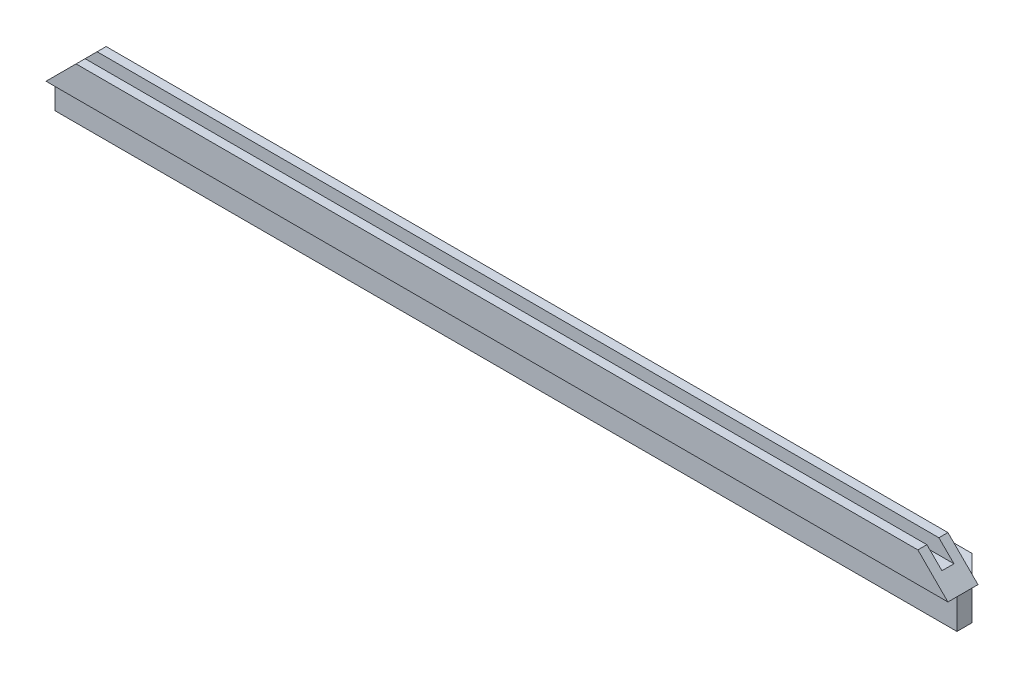
ISO-10303-21;
HEADER;
FILE_DESCRIPTION(('STEP AP214'),'2;1');
FILE_NAME('part.step','',(''),(''),'','','');
FILE_SCHEMA(('AUTOMOTIVE_DESIGN { 1 0 10303 214 1 1 1 1 }'));
ENDSEC;
DATA;
#1=APPLICATION_CONTEXT('core data for automotive mechanical design processes');
#2=APPLICATION_PROTOCOL_DEFINITION('international standard','automotive_design',2000,#1);
#3=PRODUCT_CONTEXT('',#1,'mechanical');
#4=PRODUCT('Part','Part','',(#3));
#5=PRODUCT_RELATED_PRODUCT_CATEGORY('part','',(#4));
#6=PRODUCT_DEFINITION_FORMATION('','',#4);
#7=PRODUCT_DEFINITION_CONTEXT('part definition',#1,'design');
#8=PRODUCT_DEFINITION('design','',#6,#7);
#9=PRODUCT_DEFINITION_SHAPE('','',#8);
#10=(LENGTH_UNIT() NAMED_UNIT(*) SI_UNIT(.MILLI.,.METRE.));
#11=(NAMED_UNIT(*) PLANE_ANGLE_UNIT() SI_UNIT($,.RADIAN.));
#12=(NAMED_UNIT(*) SI_UNIT($,.STERADIAN.) SOLID_ANGLE_UNIT());
#13=UNCERTAINTY_MEASURE_WITH_UNIT(LENGTH_MEASURE(1.E-05),#10,'distance_accuracy_value','');
#14=(GEOMETRIC_REPRESENTATION_CONTEXT(3) GLOBAL_UNCERTAINTY_ASSIGNED_CONTEXT((#13)) GLOBAL_UNIT_ASSIGNED_CONTEXT((#10,
#11,#12)) REPRESENTATION_CONTEXT('',''));
#15=CARTESIAN_POINT('',(0.,0.,0.));
#16=DIRECTION('',(0.,0.,1.));
#17=DIRECTION('',(1.,0.,0.));
#18=AXIS2_PLACEMENT_3D('',#15,#16,#17);
#19=CARTESIAN_POINT('',(0.,0.,41.9259450509896));
#20=DIRECTION('',(0.,0.,1.));
#21=DIRECTION('',(1.,0.,0.));
#22=AXIS2_PLACEMENT_3D('',#19,#20,#21);
#23=PLANE('',#22);
#24=DIRECTION('',(0.,1.,0.));
#25=VECTOR('',#24,1.);
#26=CARTESIAN_POINT('',(169.358553026499,7.,41.9259450509896));
#27=LINE('',#26,#25);
#28=CARTESIAN_POINT('',(169.358553026499,-3.,41.9259450509896));
#29=VERTEX_POINT('',#28);
#30=CARTESIAN_POINT('',(169.358553026499,7.,41.9259450509896));
#31=VERTEX_POINT('',#30);
#32=EDGE_CURVE('E259',#29,#31,#27,.T.);
#33=ORIENTED_EDGE('',*,*,#32,.T.);
#34=DIRECTION('',(-1.,0.,0.));
#35=VECTOR('',#34,1.);
#36=CARTESIAN_POINT('',(169.358553026499,7.,41.9259450509896));
#37=LINE('',#36,#35);
#38=CARTESIAN_POINT('',(-130.641446973501,7.,41.9259450509896));
#39=VERTEX_POINT('',#38);
#40=EDGE_CURVE('E175',#31,#39,#37,.T.);
#41=ORIENTED_EDGE('',*,*,#40,.T.);
#42=DIRECTION('',(0.,-1.,0.));
#43=VECTOR('',#42,1.);
#44=CARTESIAN_POINT('',(-130.641446973501,7.,41.9259450509896));
#45=LINE('',#44,#43);
#46=CARTESIAN_POINT('',(-130.641446973501,-3.,41.9259450509896));
#47=VERTEX_POINT('',#46);
#48=EDGE_CURVE('E253',#39,#47,#45,.T.);
#49=ORIENTED_EDGE('',*,*,#48,.T.);
#50=DIRECTION('',(1.,0.,0.));
#51=VECTOR('',#50,1.);
#52=CARTESIAN_POINT('',(-130.641446973501,-3.,41.9259450509896));
#53=LINE('',#52,#51);
#54=EDGE_CURVE('E257',#47,#29,#53,.T.);
#55=ORIENTED_EDGE('',*,*,#54,.T.);
#56=EDGE_LOOP('',(#33,#41,#49,#55));
#57=FACE_BOUND('',#56,.T.);
#58=ADVANCED_FACE('F41',(#57),#23,.T.);
#59=CARTESIAN_POINT('',(0.,7.,0.));
#60=DIRECTION('',(0.,1.,0.));
#61=DIRECTION('',(0.,0.,1.));
#62=AXIS2_PLACEMENT_3D('',#59,#60,#61);
#63=PLANE('',#62);
#64=DIRECTION('',(-1.,0.,0.));
#65=VECTOR('',#64,1.);
#66=CARTESIAN_POINT('',(169.358553026499,7.,34.9259450509896));
#67=LINE('',#66,#65);
#68=CARTESIAN_POINT('',(167.358553026499,7.,34.9259450509896));
#69=VERTEX_POINT('',#68);
#70=CARTESIAN_POINT('',(-128.6414469735,7.,34.9259450509895));
#71=VERTEX_POINT('',#70);
#72=EDGE_CURVE('E217',#69,#71,#67,.T.);
#73=ORIENTED_EDGE('',*,*,#72,.F.);
#74=DIRECTION('',(-0.707106781186551,0.,-0.707106781186543));
#75=VECTOR('',#74,1.);
#76=CARTESIAN_POINT('',(169.358553026499,7.,36.9259450509896));
#77=LINE('',#76,#75);
#78=CARTESIAN_POINT('',(159.358553026499,7.,26.9259450509896));
#79=VERTEX_POINT('',#78);
#80=EDGE_CURVE('E294',#69,#79,#77,.T.);
#81=ORIENTED_EDGE('',*,*,#80,.T.);
#82=DIRECTION('',(-1.,0.,0.));
#83=VECTOR('',#82,1.);
#84=CARTESIAN_POINT('',(-120.641446973501,7.,26.9259450509896));
#85=LINE('',#84,#83);
#86=CARTESIAN_POINT('',(-120.641446973501,7.,26.9259450509896));
#87=VERTEX_POINT('',#86);
#88=EDGE_CURVE('E293',#79,#87,#85,.T.);
#89=ORIENTED_EDGE('',*,*,#88,.T.);
#90=DIRECTION('',(-0.707106781186547,0.,0.707106781186548));
#91=VECTOR('',#90,1.);
#92=CARTESIAN_POINT('',(-130.641446973501,7.,36.9259450509896));
#93=LINE('',#92,#91);
#94=EDGE_CURVE('E296',#87,#71,#93,.T.);
#95=ORIENTED_EDGE('',*,*,#94,.T.);
#96=EDGE_LOOP('',(#73,#81,#89,#95));
#97=FACE_BOUND('',#96,.T.);
#98=ADVANCED_FACE('F354',(#97),#63,.T.);
#99=CARTESIAN_POINT('',(-130.641446973501,4.,36.9259450509896));
#100=DIRECTION('',(0.707106781186549,0.,0.707106781186546));
#101=DIRECTION('',(0.707106781186546,0.,-0.707106781186549));
#102=AXIS2_PLACEMENT_3D('',#99,#100,#101);
#103=PLANE('',#102);
#104=DIRECTION('',(0.,-1.,0.));
#105=VECTOR('',#104,1.);
#106=CARTESIAN_POINT('',(-125.641446973501,4.,31.9259450509896));
#107=LINE('',#106,#105);
#108=CARTESIAN_POINT('',(-125.641446973501,4.,31.9259450509896));
#109=VERTEX_POINT('',#108);
#110=CARTESIAN_POINT('',(-125.641446973501,0.,31.9259450509896));
#111=VERTEX_POINT('',#110);
#112=EDGE_CURVE('E315',#109,#111,#107,.T.);
#113=ORIENTED_EDGE('',*,*,#112,.T.);
#114=DIRECTION('',(-0.707106781186547,0.,0.707106781186548));
#115=VECTOR('',#114,1.);
#116=CARTESIAN_POINT('',(-130.641446973501,0.,36.9259450509896));
#117=LINE('',#116,#115);
#118=CARTESIAN_POINT('',(-120.641446973501,0.,26.9259450509896));
#119=VERTEX_POINT('',#118);
#120=EDGE_CURVE('E269',#119,#111,#117,.T.);
#121=ORIENTED_EDGE('',*,*,#120,.F.);
#122=DIRECTION('',(0.,1.,0.));
#123=VECTOR('',#122,1.);
#124=CARTESIAN_POINT('',(-120.641446973501,-3.,26.9259450509896));
#125=LINE('',#124,#123);
#126=CARTESIAN_POINT('',(-120.641446973501,-3.,26.9259450509896));
#127=VERTEX_POINT('',#126);
#128=EDGE_CURVE('E288',#127,#119,#125,.T.);
#129=ORIENTED_EDGE('',*,*,#128,.F.);
#130=DIRECTION('',(-0.707106781186547,0.,0.707106781186548));
#131=VECTOR('',#130,1.);
#132=CARTESIAN_POINT('',(-130.641446973501,-3.,36.9259450509896));
#133=LINE('',#132,#131);
#134=CARTESIAN_POINT('',(-130.641446973501,-3.,36.9259450509896));
#135=VERTEX_POINT('',#134);
#136=EDGE_CURVE('E270',#127,#135,#133,.T.);
#137=ORIENTED_EDGE('',*,*,#136,.T.);
#138=DIRECTION('',(0.,-1.,0.));
#139=VECTOR('',#138,1.);
#140=CARTESIAN_POINT('',(-130.641446973501,4.,36.9259450509896));
#141=LINE('',#140,#139);
#142=CARTESIAN_POINT('',(-130.641446973501,7.,36.9259450509896));
#143=VERTEX_POINT('',#142);
#144=EDGE_CURVE('E11',#143,#135,#141,.T.);
#145=ORIENTED_EDGE('',*,*,#144,.F.);
#146=DIRECTION('',(-0.707106781186546,0.,0.707106781186549));
#147=VECTOR('',#146,1.);
#148=CARTESIAN_POINT('',(-130.641446973501,7.,36.9259450509896));
#149=LINE('',#148,#147);
#150=EDGE_CURVE('E241',#71,#143,#149,.T.);
#151=ORIENTED_EDGE('',*,*,#150,.F.);
#152=ORIENTED_EDGE('',*,*,#94,.F.);
#153=DIRECTION('',(0.,-1.,0.));
#154=VECTOR('',#153,1.);
#155=CARTESIAN_POINT('',(-120.641446973501,7.,26.9259450509896));
#156=LINE('',#155,#154);
#157=CARTESIAN_POINT('',(-120.641446973501,4.,26.9259450509896));
#158=VERTEX_POINT('',#157);
#159=EDGE_CURVE('E299',#87,#158,#156,.T.);
#160=ORIENTED_EDGE('',*,*,#159,.T.);
#161=DIRECTION('',(-0.707106781186547,0.,0.707106781186548));
#162=VECTOR('',#161,1.);
#163=CARTESIAN_POINT('',(-130.641446973501,4.,36.9259450509896));
#164=LINE('',#163,#162);
#165=EDGE_CURVE('E303',#158,#109,#164,.T.);
#166=ORIENTED_EDGE('',*,*,#165,.T.);
#167=EDGE_LOOP('',(#113,#121,#129,#137,#145,#151,#152,#160,#166));
#168=FACE_BOUND('',#167,.T.);
#169=ADVANCED_FACE('F43',(#168),#103,.F.);
#170=CARTESIAN_POINT('',(164.358553026499,4.,31.9259450509896));
#171=DIRECTION('',(-0.707106781186545,0.,0.70710678118655));
#172=DIRECTION('',(0.70710678118655,0.,0.707106781186545));
#173=AXIS2_PLACEMENT_3D('',#170,#171,#172);
#174=PLANE('',#173);
#175=DIRECTION('',(0.,-1.,0.));
#176=VECTOR('',#175,1.);
#177=CARTESIAN_POINT('',(169.358553026499,4.,36.9259450509896));
#178=LINE('',#177,#176);
#179=CARTESIAN_POINT('',(169.358553026499,7.,36.9259450509896));
#180=VERTEX_POINT('',#179);
#181=CARTESIAN_POINT('',(169.358553026499,-3.,36.9259450509896));
#182=VERTEX_POINT('',#181);
#183=EDGE_CURVE('E50',#180,#182,#178,.T.);
#184=ORIENTED_EDGE('',*,*,#183,.T.);
#185=DIRECTION('',(-0.707106781186551,0.,-0.707106781186543));
#186=VECTOR('',#185,1.);
#187=CARTESIAN_POINT('',(169.358553026499,-3.,36.9259450509896));
#188=LINE('',#187,#186);
#189=CARTESIAN_POINT('',(159.358553026499,-3.,26.9259450509896));
#190=VERTEX_POINT('',#189);
#191=EDGE_CURVE('E277',#182,#190,#188,.T.);
#192=ORIENTED_EDGE('',*,*,#191,.T.);
#193=DIRECTION('',(0.,1.,0.));
#194=VECTOR('',#193,1.);
#195=CARTESIAN_POINT('',(159.358553026499,-3.,26.9259450509896));
#196=LINE('',#195,#194);
#197=CARTESIAN_POINT('',(159.358553026499,0.,26.9259450509896));
#198=VERTEX_POINT('',#197);
#199=EDGE_CURVE('E280',#190,#198,#196,.T.);
#200=ORIENTED_EDGE('',*,*,#199,.T.);
#201=DIRECTION('',(-0.707106781186551,0.,-0.707106781186543));
#202=VECTOR('',#201,1.);
#203=CARTESIAN_POINT('',(169.358553026499,0.,36.9259450509896));
#204=LINE('',#203,#202);
#205=CARTESIAN_POINT('',(164.358553026499,0.,31.9259450509896));
#206=VERTEX_POINT('',#205);
#207=EDGE_CURVE('E274',#206,#198,#204,.T.);
#208=ORIENTED_EDGE('',*,*,#207,.F.);
#209=DIRECTION('',(0.,-1.,0.));
#210=VECTOR('',#209,1.);
#211=CARTESIAN_POINT('',(164.358553026499,4.,31.9259450509896));
#212=LINE('',#211,#210);
#213=CARTESIAN_POINT('',(164.358553026499,4.,31.9259450509896));
#214=VERTEX_POINT('',#213);
#215=EDGE_CURVE('E56',#214,#206,#212,.T.);
#216=ORIENTED_EDGE('',*,*,#215,.F.);
#217=DIRECTION('',(-0.707106781186551,0.,-0.707106781186543));
#218=VECTOR('',#217,1.);
#219=CARTESIAN_POINT('',(169.358553026499,4.,36.9259450509896));
#220=LINE('',#219,#218);
#221=CARTESIAN_POINT('',(159.358553026499,4.,26.9259450509896));
#222=VERTEX_POINT('',#221);
#223=EDGE_CURVE('E290',#214,#222,#220,.T.);
#224=ORIENTED_EDGE('',*,*,#223,.T.);
#225=DIRECTION('',(0.,-1.,0.));
#226=VECTOR('',#225,1.);
#227=CARTESIAN_POINT('',(159.358553026499,7.,26.9259450509896));
#228=LINE('',#227,#226);
#229=EDGE_CURVE('E308',#79,#222,#228,.T.);
#230=ORIENTED_EDGE('',*,*,#229,.F.);
#231=ORIENTED_EDGE('',*,*,#80,.F.);
#232=EDGE_CURVE('E291',#180,#69,#77,.T.);
#233=ORIENTED_EDGE('',*,*,#232,.F.);
#234=EDGE_LOOP('',(#184,#192,#200,#208,#216,#224,#230,#231,#233));
#235=FACE_BOUND('',#234,.T.);
#236=ADVANCED_FACE('F324',(#235),#174,.F.);
#237=CARTESIAN_POINT('',(-125.641446973501,4.,31.9259450509896));
#238=DIRECTION('',(0.,0.,1.));
#239=DIRECTION('',(1.,0.,0.));
#240=AXIS2_PLACEMENT_3D('',#237,#238,#239);
#241=PLANE('',#240);
#242=DIRECTION('',(-1.,0.,0.));
#243=VECTOR('',#242,1.);
#244=CARTESIAN_POINT('',(-125.641446973501,0.,31.9259450509896));
#245=LINE('',#244,#243);
#246=EDGE_CURVE('E311',#206,#111,#245,.T.);
#247=ORIENTED_EDGE('',*,*,#246,.T.);
#248=ORIENTED_EDGE('',*,*,#112,.F.);
#249=DIRECTION('',(-1.,0.,0.));
#250=VECTOR('',#249,1.);
#251=CARTESIAN_POINT('',(-125.641446973501,4.,31.9259450509896));
#252=LINE('',#251,#250);
#253=EDGE_CURVE('E312',#214,#109,#252,.T.);
#254=ORIENTED_EDGE('',*,*,#253,.F.);
#255=ORIENTED_EDGE('',*,*,#215,.T.);
#256=EDGE_LOOP('',(#247,#248,#254,#255));
#257=FACE_BOUND('',#256,.T.);
#258=ADVANCED_FACE('F340',(#257),#241,.F.);
#259=CARTESIAN_POINT('',(0.,4.,0.));
#260=DIRECTION('',(0.,1.,0.));
#261=DIRECTION('',(0.,0.,1.));
#262=AXIS2_PLACEMENT_3D('',#259,#260,#261);
#263=PLANE('',#262);
#264=ORIENTED_EDGE('',*,*,#223,.F.);
#265=ORIENTED_EDGE('',*,*,#253,.T.);
#266=ORIENTED_EDGE('',*,*,#165,.F.);
#267=DIRECTION('',(-1.,0.,0.));
#268=VECTOR('',#267,1.);
#269=CARTESIAN_POINT('',(-120.641446973501,4.,26.9259450509896));
#270=LINE('',#269,#268);
#271=EDGE_CURVE('E301',#222,#158,#270,.T.);
#272=ORIENTED_EDGE('',*,*,#271,.F.);
#273=EDGE_LOOP('',(#264,#265,#266,#272));
#274=FACE_BOUND('',#273,.T.);
#275=ADVANCED_FACE('F345',(#274),#263,.F.);
#276=CARTESIAN_POINT('',(-120.641446973501,7.,26.9259450509896));
#277=DIRECTION('',(0.,0.,1.));
#278=DIRECTION('',(1.,0.,0.));
#279=AXIS2_PLACEMENT_3D('',#276,#277,#278);
#280=PLANE('',#279);
#281=ORIENTED_EDGE('',*,*,#271,.T.);
#282=ORIENTED_EDGE('',*,*,#159,.F.);
#283=ORIENTED_EDGE('',*,*,#88,.F.);
#284=ORIENTED_EDGE('',*,*,#229,.T.);
#285=EDGE_LOOP('',(#281,#282,#283,#284));
#286=FACE_BOUND('',#285,.T.);
#287=ADVANCED_FACE('F349',(#286),#280,.F.);
#288=CARTESIAN_POINT('',(-120.641446973501,-3.,26.9259450509896));
#289=DIRECTION('',(0.,0.,-1.));
#290=DIRECTION('',(-1.,0.,0.));
#291=AXIS2_PLACEMENT_3D('',#288,#289,#290);
#292=PLANE('',#291);
#293=DIRECTION('',(-1.,0.,0.));
#294=VECTOR('',#293,1.);
#295=CARTESIAN_POINT('',(-120.641446973501,0.,26.9259450509896));
#296=LINE('',#295,#294);
#297=EDGE_CURVE('E282',#198,#119,#296,.T.);
#298=ORIENTED_EDGE('',*,*,#297,.F.);
#299=ORIENTED_EDGE('',*,*,#199,.F.);
#300=DIRECTION('',(-1.,0.,0.));
#301=VECTOR('',#300,1.);
#302=CARTESIAN_POINT('',(-120.641446973501,-3.,26.9259450509896));
#303=LINE('',#302,#301);
#304=EDGE_CURVE('E273',#190,#127,#303,.T.);
#305=ORIENTED_EDGE('',*,*,#304,.T.);
#306=ORIENTED_EDGE('',*,*,#128,.T.);
#307=EDGE_LOOP('',(#298,#299,#305,#306));
#308=FACE_BOUND('',#307,.T.);
#309=ADVANCED_FACE('F336',(#308),#292,.T.);
#310=CARTESIAN_POINT('',(0.,-3.,0.));
#311=DIRECTION('',(0.,-1.,0.));
#312=DIRECTION('',(0.,0.,1.));
#313=AXIS2_PLACEMENT_3D('',#310,#311,#312);
#314=PLANE('',#313);
#315=ORIENTED_EDGE('',*,*,#191,.F.);
#316=DIRECTION('',(0.,0.,-1.));
#317=VECTOR('',#316,1.);
#318=CARTESIAN_POINT('',(169.358553026499,-3.,41.9259450509896));
#319=LINE('',#318,#317);
#320=EDGE_CURVE('E265',#29,#182,#319,.T.);
#321=ORIENTED_EDGE('',*,*,#320,.F.);
#322=ORIENTED_EDGE('',*,*,#54,.F.);
#323=DIRECTION('',(0.,0.,-1.));
#324=VECTOR('',#323,1.);
#325=CARTESIAN_POINT('',(-130.641446973501,-3.,41.9259450509896));
#326=LINE('',#325,#324);
#327=EDGE_CURVE('E267',#47,#135,#326,.T.);
#328=ORIENTED_EDGE('',*,*,#327,.T.);
#329=ORIENTED_EDGE('',*,*,#136,.F.);
#330=ORIENTED_EDGE('',*,*,#304,.F.);
#331=EDGE_LOOP('',(#315,#321,#322,#328,#329,#330));
#332=FACE_BOUND('',#331,.T.);
#333=ADVANCED_FACE('F331',(#332),#314,.T.);
#334=CARTESIAN_POINT('',(0.,0.,0.));
#335=DIRECTION('',(0.,-1.,0.));
#336=DIRECTION('',(0.,0.,1.));
#337=AXIS2_PLACEMENT_3D('',#334,#335,#336);
#338=PLANE('',#337);
#339=ORIENTED_EDGE('',*,*,#246,.F.);
#340=ORIENTED_EDGE('',*,*,#207,.T.);
#341=ORIENTED_EDGE('',*,*,#297,.T.);
#342=ORIENTED_EDGE('',*,*,#120,.T.);
#343=EDGE_LOOP('',(#339,#340,#341,#342));
#344=FACE_BOUND('',#343,.T.);
#345=ADVANCED_FACE('F423',(#344),#338,.F.);
#346=CARTESIAN_POINT('',(-130.641446973501,7.,41.9259450509896));
#347=DIRECTION('',(1.,0.,0.));
#348=DIRECTION('',(0.,0.,-1.));
#349=AXIS2_PLACEMENT_3D('',#346,#347,#348);
#350=PLANE('',#349);
#351=ORIENTED_EDGE('',*,*,#144,.T.);
#352=ORIENTED_EDGE('',*,*,#327,.F.);
#353=ORIENTED_EDGE('',*,*,#48,.F.);
#354=DIRECTION('',(0.,0.,-1.));
#355=VECTOR('',#354,1.);
#356=CARTESIAN_POINT('',(-130.641446973501,7.,41.9259450509896));
#357=LINE('',#356,#355);
#358=EDGE_CURVE('E261',#39,#143,#357,.T.);
#359=ORIENTED_EDGE('',*,*,#358,.T.);
#360=EDGE_LOOP('',(#351,#352,#353,#359));
#361=FACE_BOUND('',#360,.T.);
#362=ADVANCED_FACE('F372',(#361),#350,.F.);
#363=CARTESIAN_POINT('',(169.358553026499,7.,41.9259450509896));
#364=DIRECTION('',(-1.,0.,0.));
#365=DIRECTION('',(0.,0.,1.));
#366=AXIS2_PLACEMENT_3D('',#363,#364,#365);
#367=PLANE('',#366);
#368=ORIENTED_EDGE('',*,*,#183,.F.);
#369=DIRECTION('',(0.,0.,-1.));
#370=VECTOR('',#369,1.);
#371=CARTESIAN_POINT('',(169.358553026499,7.,41.9259450509896));
#372=LINE('',#371,#370);
#373=EDGE_CURVE('E263',#31,#180,#372,.T.);
#374=ORIENTED_EDGE('',*,*,#373,.F.);
#375=ORIENTED_EDGE('',*,*,#32,.F.);
#376=ORIENTED_EDGE('',*,*,#320,.T.);
#377=EDGE_LOOP('',(#368,#374,#375,#376));
#378=FACE_BOUND('',#377,.T.);
#379=ADVANCED_FACE('F375',(#378),#367,.F.);
#380=CARTESIAN_POINT('',(-125.6414469735,12.,37.9259450509896));
#381=DIRECTION('',(-0.707106781186543,0.707106781186552,0.));
#382=DIRECTION('',(-0.707106781186552,-0.707106781186543,0.));
#383=AXIS2_PLACEMENT_3D('',#380,#381,#382);
#384=PLANE('',#383);
#385=ORIENTED_EDGE('',*,*,#358,.F.);
#386=DIRECTION('',(0.,0.,-1.));
#387=VECTOR('',#386,1.);
#388=CARTESIAN_POINT('',(-130.641446973501,7.,44.9259450509896));
#389=LINE('',#388,#387);
#390=CARTESIAN_POINT('',(-130.641446973501,7.,44.9259450509896));
#391=VERTEX_POINT('',#390);
#392=EDGE_CURVE('E200',#391,#39,#389,.T.);
#393=ORIENTED_EDGE('',*,*,#392,.F.);
#394=DIRECTION('',(0.707106781186552,0.707106781186543,0.));
#395=VECTOR('',#394,1.);
#396=CARTESIAN_POINT('',(-130.641446973501,7.,44.9259450509896));
#397=LINE('',#396,#395);
#398=CARTESIAN_POINT('',(-120.6414469735,17.,44.9259450509896));
#399=VERTEX_POINT('',#398);
#400=EDGE_CURVE('E189',#391,#399,#397,.T.);
#401=ORIENTED_EDGE('',*,*,#400,.T.);
#402=DIRECTION('',(0.,0.,-1.));
#403=VECTOR('',#402,1.);
#404=CARTESIAN_POINT('',(-120.6414469735,17.,44.9259450509896));
#405=LINE('',#404,#403);
#406=CARTESIAN_POINT('',(-120.6414469735,17.,41.9259450509896));
#407=VERTEX_POINT('',#406);
#408=EDGE_CURVE('E209',#399,#407,#405,.T.);
#409=ORIENTED_EDGE('',*,*,#408,.T.);
#410=DIRECTION('',(0.707106781186552,0.707106781186543,0.));
#411=VECTOR('',#410,1.);
#412=CARTESIAN_POINT('',(-130.641446973501,7.,41.9259450509896));
#413=LINE('',#412,#411);
#414=CARTESIAN_POINT('',(-125.6414469735,12.,41.9259450509896));
#415=VERTEX_POINT('',#414);
#416=EDGE_CURVE('E190',#415,#407,#413,.T.);
#417=ORIENTED_EDGE('',*,*,#416,.F.);
#418=DIRECTION('',(0.,0.,1.));
#419=VECTOR('',#418,1.);
#420=CARTESIAN_POINT('',(-125.6414469735,12.,37.9259450509896));
#421=LINE('',#420,#419);
#422=CARTESIAN_POINT('',(-125.6414469735,12.,37.9259450509896));
#423=VERTEX_POINT('',#422);
#424=EDGE_CURVE('E250',#423,#415,#421,.T.);
#425=ORIENTED_EDGE('',*,*,#424,.F.);
#426=DIRECTION('',(0.707106781186552,0.707106781186543,0.));
#427=VECTOR('',#426,1.);
#428=CARTESIAN_POINT('',(-130.641446973501,7.,37.9259450509896));
#429=LINE('',#428,#427);
#430=CARTESIAN_POINT('',(-120.6414469735,17.,37.9259450509896));
#431=VERTEX_POINT('',#430);
#432=EDGE_CURVE('E179',#423,#431,#429,.T.);
#433=ORIENTED_EDGE('',*,*,#432,.T.);
#434=DIRECTION('',(0.,0.,1.));
#435=VECTOR('',#434,1.);
#436=CARTESIAN_POINT('',(-120.6414469735,17.,34.9259450509896));
#437=LINE('',#436,#435);
#438=CARTESIAN_POINT('',(-120.6414469735,17.,34.9259450509896));
#439=VERTEX_POINT('',#438);
#440=EDGE_CURVE('E235',#439,#431,#437,.T.);
#441=ORIENTED_EDGE('',*,*,#440,.F.);
#442=DIRECTION('',(0.707106781186552,0.707106781186543,0.));
#443=VECTOR('',#442,1.);
#444=CARTESIAN_POINT('',(-130.641446973501,7.,34.9259450509896));
#445=LINE('',#444,#443);
#446=CARTESIAN_POINT('',(-130.641446973501,7.,34.9259450509896));
#447=VERTEX_POINT('',#446);
#448=EDGE_CURVE('E216',#447,#439,#445,.T.);
#449=ORIENTED_EDGE('',*,*,#448,.F.);
#450=DIRECTION('',(0.,0.,1.));
#451=VECTOR('',#450,1.);
#452=CARTESIAN_POINT('',(-130.641446973501,7.,34.9259450509896));
#453=LINE('',#452,#451);
#454=EDGE_CURVE('E238',#447,#143,#453,.T.);
#455=ORIENTED_EDGE('',*,*,#454,.T.);
#456=EDGE_LOOP('',(#385,#393,#401,#409,#417,#425,#433,#441,#449,#455));
#457=FACE_BOUND('',#456,.T.);
#458=ADVANCED_FACE('F365',(#457),#384,.T.);
#459=CARTESIAN_POINT('',(-125.6414469735,12.,37.9259450509896));
#460=DIRECTION('',(0.,1.,0.));
#461=DIRECTION('',(0.,0.,1.));
#462=AXIS2_PLACEMENT_3D('',#459,#460,#461);
#463=PLANE('',#462);
#464=DIRECTION('',(-1.,0.,0.));
#465=VECTOR('',#464,1.);
#466=CARTESIAN_POINT('',(-125.6414469735,12.,41.9259450509896));
#467=LINE('',#466,#465);
#468=CARTESIAN_POINT('',(164.358553026499,12.,41.9259450509896));
#469=VERTEX_POINT('',#468);
#470=EDGE_CURVE('E244',#469,#415,#467,.T.);
#471=ORIENTED_EDGE('',*,*,#470,.F.);
#472=DIRECTION('',(0.,0.,1.));
#473=VECTOR('',#472,1.);
#474=CARTESIAN_POINT('',(164.358553026499,12.,37.9259450509896));
#475=LINE('',#474,#473);
#476=CARTESIAN_POINT('',(164.358553026499,12.,37.9259450509896));
#477=VERTEX_POINT('',#476);
#478=EDGE_CURVE('E248',#477,#469,#475,.T.);
#479=ORIENTED_EDGE('',*,*,#478,.F.);
#480=DIRECTION('',(-1.,0.,0.));
#481=VECTOR('',#480,1.);
#482=CARTESIAN_POINT('',(-125.6414469735,12.,37.9259450509896));
#483=LINE('',#482,#481);
#484=EDGE_CURVE('E245',#477,#423,#483,.T.);
#485=ORIENTED_EDGE('',*,*,#484,.T.);
#486=ORIENTED_EDGE('',*,*,#424,.T.);
#487=EDGE_LOOP('',(#471,#479,#485,#486));
#488=FACE_BOUND('',#487,.T.);
#489=ADVANCED_FACE('F392',(#488),#463,.T.);
#490=CARTESIAN_POINT('',(164.358553026499,12.,37.9259450509896));
#491=DIRECTION('',(0.707106781186548,0.707106781186547,0.));
#492=DIRECTION('',(-0.707106781186547,0.707106781186548,0.));
#493=AXIS2_PLACEMENT_3D('',#490,#491,#492);
#494=PLANE('',#493);
#495=ORIENTED_EDGE('',*,*,#478,.T.);
#496=DIRECTION('',(0.707106781186547,-0.707106781186548,0.));
#497=VECTOR('',#496,1.);
#498=CARTESIAN_POINT('',(169.358553026499,7.,41.9259450509896));
#499=LINE('',#498,#497);
#500=CARTESIAN_POINT('',(159.358553026499,17.,41.9259450509896));
#501=VERTEX_POINT('',#500);
#502=EDGE_CURVE('E202',#501,#469,#499,.T.);
#503=ORIENTED_EDGE('',*,*,#502,.F.);
#504=DIRECTION('',(0.,0.,-1.));
#505=VECTOR('',#504,1.);
#506=CARTESIAN_POINT('',(159.358553026499,17.,44.9259450509896));
#507=LINE('',#506,#505);
#508=CARTESIAN_POINT('',(159.358553026499,17.,44.9259450509896));
#509=VERTEX_POINT('',#508);
#510=EDGE_CURVE('E180',#509,#501,#507,.T.);
#511=ORIENTED_EDGE('',*,*,#510,.F.);
#512=DIRECTION('',(0.707106781186547,-0.707106781186548,0.));
#513=VECTOR('',#512,1.);
#514=CARTESIAN_POINT('',(169.358553026499,7.,44.9259450509896));
#515=LINE('',#514,#513);
#516=CARTESIAN_POINT('',(169.358553026499,7.,44.9259450509896));
#517=VERTEX_POINT('',#516);
#518=EDGE_CURVE('E186',#509,#517,#515,.T.);
#519=ORIENTED_EDGE('',*,*,#518,.T.);
#520=DIRECTION('',(0.,0.,-1.));
#521=VECTOR('',#520,1.);
#522=CARTESIAN_POINT('',(169.358553026499,7.,44.9259450509896));
#523=LINE('',#522,#521);
#524=EDGE_CURVE('E169',#517,#31,#523,.T.);
#525=ORIENTED_EDGE('',*,*,#524,.T.);
#526=ORIENTED_EDGE('',*,*,#373,.T.);
#527=DIRECTION('',(0.,0.,1.));
#528=VECTOR('',#527,1.);
#529=CARTESIAN_POINT('',(169.358553026499,7.,34.9259450509896));
#530=LINE('',#529,#528);
#531=CARTESIAN_POINT('',(169.358553026499,7.,34.9259450509896));
#532=VERTEX_POINT('',#531);
#533=EDGE_CURVE('E224',#532,#180,#530,.T.);
#534=ORIENTED_EDGE('',*,*,#533,.F.);
#535=DIRECTION('',(0.707106781186547,-0.707106781186548,0.));
#536=VECTOR('',#535,1.);
#537=CARTESIAN_POINT('',(169.358553026499,7.,34.9259450509896));
#538=LINE('',#537,#536);
#539=CARTESIAN_POINT('',(159.358553026499,17.,34.9259450509896));
#540=VERTEX_POINT('',#539);
#541=EDGE_CURVE('E222',#540,#532,#538,.T.);
#542=ORIENTED_EDGE('',*,*,#541,.F.);
#543=DIRECTION('',(0.,0.,1.));
#544=VECTOR('',#543,1.);
#545=CARTESIAN_POINT('',(159.358553026499,17.,34.9259450509896));
#546=LINE('',#545,#544);
#547=CARTESIAN_POINT('',(159.358553026499,17.,37.9259450509896));
#548=VERTEX_POINT('',#547);
#549=EDGE_CURVE('E232',#540,#548,#546,.T.);
#550=ORIENTED_EDGE('',*,*,#549,.T.);
#551=DIRECTION('',(0.707106781186547,-0.707106781186548,0.));
#552=VECTOR('',#551,1.);
#553=CARTESIAN_POINT('',(169.358553026499,7.,37.9259450509896));
#554=LINE('',#553,#552);
#555=EDGE_CURVE('E228',#548,#477,#554,.T.);
#556=ORIENTED_EDGE('',*,*,#555,.T.);
#557=EDGE_LOOP('',(#495,#503,#511,#519,#525,#526,#534,#542,#550,#556));
#558=FACE_BOUND('',#557,.T.);
#559=ADVANCED_FACE('F193',(#558),#494,.T.);
#560=CARTESIAN_POINT('',(169.358553026499,7.,34.9259450509896));
#561=DIRECTION('',(0.,1.,0.));
#562=DIRECTION('',(0.,0.,1.));
#563=AXIS2_PLACEMENT_3D('',#560,#561,#562);
#564=PLANE('',#563);
#565=EDGE_CURVE('E218',#71,#447,#67,.T.);
#566=ORIENTED_EDGE('',*,*,#565,.F.);
#567=ORIENTED_EDGE('',*,*,#150,.T.);
#568=ORIENTED_EDGE('',*,*,#454,.F.);
#569=EDGE_LOOP('',(#566,#567,#568));
#570=FACE_BOUND('',#569,.T.);
#571=ADVANCED_FACE('F368',(#570),#564,.F.);
#572=ORIENTED_EDGE('',*,*,#533,.T.);
#573=ORIENTED_EDGE('',*,*,#232,.T.);
#574=EDGE_CURVE('E213',#532,#69,#67,.T.);
#575=ORIENTED_EDGE('',*,*,#574,.F.);
#576=EDGE_LOOP('',(#572,#573,#575));
#577=FACE_BOUND('',#576,.T.);
#578=ADVANCED_FACE('F380',(#577),#564,.F.);
#579=CARTESIAN_POINT('',(159.358553026499,17.,34.9259450509896));
#580=DIRECTION('',(0.,-1.,0.));
#581=DIRECTION('',(0.,0.,-1.));
#582=AXIS2_PLACEMENT_3D('',#579,#580,#581);
#583=PLANE('',#582);
#584=DIRECTION('',(1.,0.,0.));
#585=VECTOR('',#584,1.);
#586=CARTESIAN_POINT('',(159.358553026499,17.,37.9259450509896));
#587=LINE('',#586,#585);
#588=EDGE_CURVE('E226',#431,#548,#587,.T.);
#589=ORIENTED_EDGE('',*,*,#588,.T.);
#590=ORIENTED_EDGE('',*,*,#549,.F.);
#591=DIRECTION('',(1.,0.,0.));
#592=VECTOR('',#591,1.);
#593=CARTESIAN_POINT('',(159.358553026499,17.,34.9259450509896));
#594=LINE('',#593,#592);
#595=EDGE_CURVE('E220',#439,#540,#594,.T.);
#596=ORIENTED_EDGE('',*,*,#595,.F.);
#597=ORIENTED_EDGE('',*,*,#440,.T.);
#598=EDGE_LOOP('',(#589,#590,#596,#597));
#599=FACE_BOUND('',#598,.T.);
#600=ADVANCED_FACE('F399',(#599),#583,.F.);
#601=CARTESIAN_POINT('',(0.,0.,34.9259450509896));
#602=DIRECTION('',(0.,0.,-1.));
#603=DIRECTION('',(-1.,0.,0.));
#604=AXIS2_PLACEMENT_3D('',#601,#602,#603);
#605=PLANE('',#604);
#606=ORIENTED_EDGE('',*,*,#574,.T.);
#607=ORIENTED_EDGE('',*,*,#72,.T.);
#608=ORIENTED_EDGE('',*,*,#565,.T.);
#609=ORIENTED_EDGE('',*,*,#448,.T.);
#610=ORIENTED_EDGE('',*,*,#595,.T.);
#611=ORIENTED_EDGE('',*,*,#541,.T.);
#612=EDGE_LOOP('',(#606,#607,#608,#609,#610,#611));
#613=FACE_BOUND('',#612,.T.);
#614=ADVANCED_FACE('F359',(#613),#605,.T.);
#615=CARTESIAN_POINT('',(0.,0.,37.9259450509896));
#616=DIRECTION('',(0.,0.,-1.));
#617=DIRECTION('',(-1.,0.,0.));
#618=AXIS2_PLACEMENT_3D('',#615,#616,#617);
#619=PLANE('',#618);
#620=ORIENTED_EDGE('',*,*,#484,.F.);
#621=ORIENTED_EDGE('',*,*,#555,.F.);
#622=ORIENTED_EDGE('',*,*,#588,.F.);
#623=ORIENTED_EDGE('',*,*,#432,.F.);
#624=EDGE_LOOP('',(#620,#621,#622,#623));
#625=FACE_BOUND('',#624,.T.);
#626=ADVANCED_FACE('F387',(#625),#619,.F.);
#627=CARTESIAN_POINT('',(0.,0.,41.9259450509896));
#628=DIRECTION('',(0.,0.,1.));
#629=DIRECTION('',(-1.,0.,0.));
#630=AXIS2_PLACEMENT_3D('',#627,#628,#629);
#631=PLANE('',#630);
#632=ORIENTED_EDGE('',*,*,#502,.T.);
#633=ORIENTED_EDGE('',*,*,#470,.T.);
#634=ORIENTED_EDGE('',*,*,#416,.T.);
#635=DIRECTION('',(1.,0.,0.));
#636=VECTOR('',#635,1.);
#637=CARTESIAN_POINT('',(159.358553026499,17.,41.9259450509896));
#638=LINE('',#637,#636);
#639=EDGE_CURVE('E204',#407,#501,#638,.T.);
#640=ORIENTED_EDGE('',*,*,#639,.T.);
#641=EDGE_LOOP('',(#632,#633,#634,#640));
#642=FACE_BOUND('',#641,.T.);
#643=ADVANCED_FACE('F395',(#642),#631,.F.);
#644=CARTESIAN_POINT('',(169.358553026499,7.,44.9259450509896));
#645=DIRECTION('',(0.,-1.,0.));
#646=DIRECTION('',(0.,0.,-1.));
#647=AXIS2_PLACEMENT_3D('',#644,#645,#646);
#648=PLANE('',#647);
#649=ORIENTED_EDGE('',*,*,#40,.F.);
#650=ORIENTED_EDGE('',*,*,#524,.F.);
#651=DIRECTION('',(-1.,0.,0.));
#652=VECTOR('',#651,1.);
#653=CARTESIAN_POINT('',(169.358553026499,7.,44.9259450509896));
#654=LINE('',#653,#652);
#655=EDGE_CURVE('E172',#517,#391,#654,.T.);
#656=ORIENTED_EDGE('',*,*,#655,.T.);
#657=ORIENTED_EDGE('',*,*,#392,.T.);
#658=EDGE_LOOP('',(#649,#650,#656,#657));
#659=FACE_BOUND('',#658,.T.);
#660=ADVANCED_FACE('F171',(#659),#648,.T.);
#661=CARTESIAN_POINT('',(159.358553026499,17.,44.9259450509896));
#662=DIRECTION('',(0.,1.,0.));
#663=DIRECTION('',(0.,0.,1.));
#664=AXIS2_PLACEMENT_3D('',#661,#662,#663);
#665=PLANE('',#664);
#666=ORIENTED_EDGE('',*,*,#639,.F.);
#667=ORIENTED_EDGE('',*,*,#408,.F.);
#668=DIRECTION('',(1.,0.,0.));
#669=VECTOR('',#668,1.);
#670=CARTESIAN_POINT('',(159.358553026499,17.,44.9259450509896));
#671=LINE('',#670,#669);
#672=EDGE_CURVE('E195',#399,#509,#671,.T.);
#673=ORIENTED_EDGE('',*,*,#672,.T.);
#674=ORIENTED_EDGE('',*,*,#510,.T.);
#675=EDGE_LOOP('',(#666,#667,#673,#674));
#676=FACE_BOUND('',#675,.T.);
#677=ADVANCED_FACE('F398',(#676),#665,.T.);
#678=CARTESIAN_POINT('',(0.,0.,44.9259450509896));
#679=DIRECTION('',(0.,0.,1.));
#680=DIRECTION('',(-1.,0.,0.));
#681=AXIS2_PLACEMENT_3D('',#678,#679,#680);
#682=PLANE('',#681);
#683=ORIENTED_EDGE('',*,*,#655,.F.);
#684=ORIENTED_EDGE('',*,*,#518,.F.);
#685=ORIENTED_EDGE('',*,*,#672,.F.);
#686=ORIENTED_EDGE('',*,*,#400,.F.);
#687=EDGE_LOOP('',(#683,#684,#685,#686));
#688=FACE_BOUND('',#687,.T.);
#689=ADVANCED_FACE('F184',(#688),#682,.T.);
#690=CLOSED_SHELL('',(#58,#98,#169,#236,#258,#275,#287,#309,#333,#345,#362,#379,#458,#489,#559,
#571,#578,#600,#614,#626,#643,#660,#677,#689));
#691=MANIFOLD_SOLID_BREP('B2',#690);
#692=ADVANCED_BREP_SHAPE_REPRESENTATION('',(#18,#691),#14);
#693=SHAPE_DEFINITION_REPRESENTATION(#9,#692);
ENDSEC;
END-ISO-10303-21;
